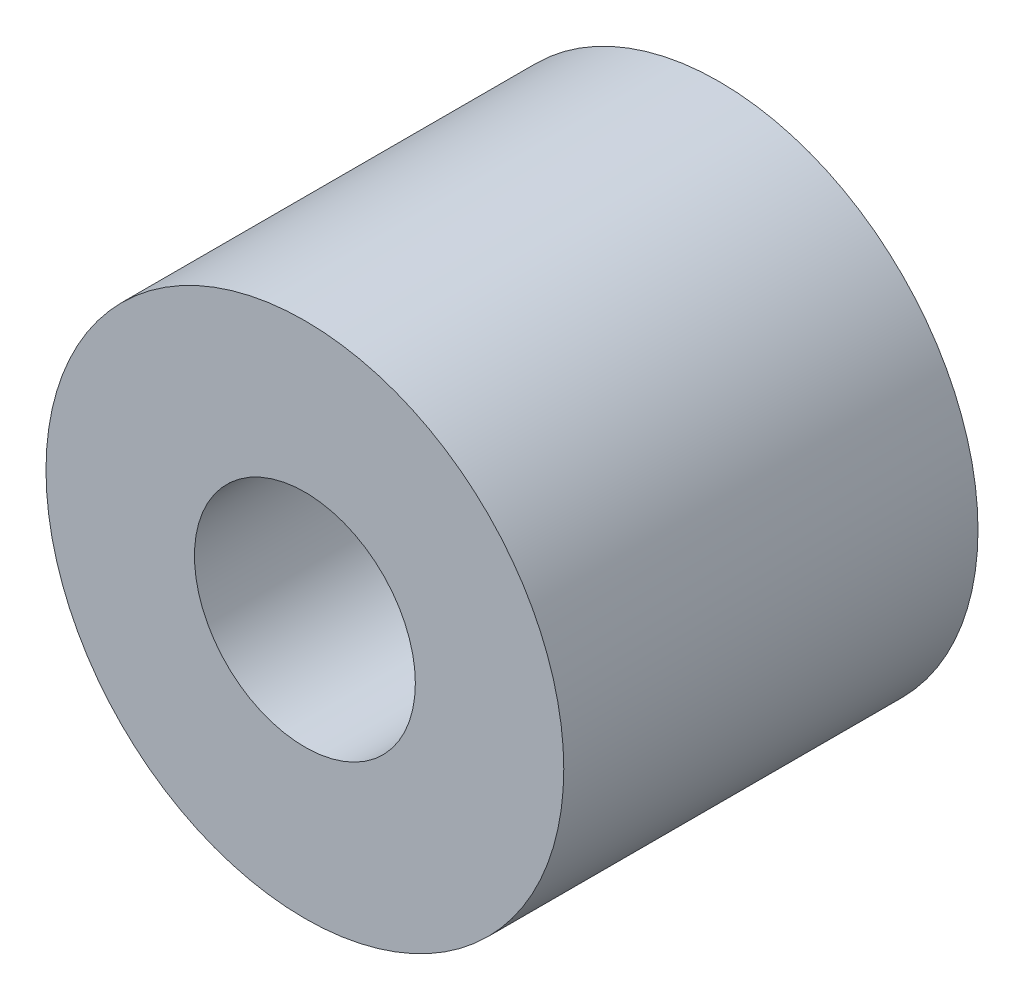
ISO-10303-21;
HEADER;
FILE_DESCRIPTION(('STEP AP214'),'2;1');
FILE_NAME('part.step','',(''),(''),'','','');
FILE_SCHEMA(('AUTOMOTIVE_DESIGN { 1 0 10303 214 1 1 1 1 }'));
ENDSEC;
DATA;
#1=APPLICATION_CONTEXT('core data for automotive mechanical design processes');
#2=APPLICATION_PROTOCOL_DEFINITION('international standard','automotive_design',2000,#1);
#3=PRODUCT_CONTEXT('',#1,'mechanical');
#4=PRODUCT('Part','Part','',(#3));
#5=PRODUCT_RELATED_PRODUCT_CATEGORY('part','',(#4));
#6=PRODUCT_DEFINITION_FORMATION('','',#4);
#7=PRODUCT_DEFINITION_CONTEXT('part definition',#1,'design');
#8=PRODUCT_DEFINITION('design','',#6,#7);
#9=PRODUCT_DEFINITION_SHAPE('','',#8);
#10=(LENGTH_UNIT() NAMED_UNIT(*) SI_UNIT(.MILLI.,.METRE.));
#11=(NAMED_UNIT(*) PLANE_ANGLE_UNIT() SI_UNIT($,.RADIAN.));
#12=(NAMED_UNIT(*) SI_UNIT($,.STERADIAN.) SOLID_ANGLE_UNIT());
#13=UNCERTAINTY_MEASURE_WITH_UNIT(LENGTH_MEASURE(1.E-05),#10,'distance_accuracy_value','');
#14=(GEOMETRIC_REPRESENTATION_CONTEXT(3) GLOBAL_UNCERTAINTY_ASSIGNED_CONTEXT((#13)) GLOBAL_UNIT_ASSIGNED_CONTEXT((#10,
#11,#12)) REPRESENTATION_CONTEXT('',''));
#15=CARTESIAN_POINT('',(0.,0.,0.));
#16=DIRECTION('',(0.,0.,1.));
#17=DIRECTION('',(1.,0.,0.));
#18=AXIS2_PLACEMENT_3D('',#15,#16,#17);
#19=CARTESIAN_POINT('',(0.,0.,12.));
#20=DIRECTION('',(0.,0.,1.));
#21=DIRECTION('',(1.,0.,0.));
#22=AXIS2_PLACEMENT_3D('',#19,#20,#21);
#23=PLANE('',#22);
#24=CARTESIAN_POINT('',(0.,0.,12.));
#25=DIRECTION('',(0.,0.,1.));
#26=DIRECTION('',(1.,0.,0.));
#27=AXIS2_PLACEMENT_3D('',#24,#25,#26);
#28=CIRCLE('',#27,7.5);
#29=CARTESIAN_POINT('',(7.5,0.,12.));
#30=VERTEX_POINT('',#29);
#31=EDGE_CURVE('E10',#30,#30,#28,.T.);
#32=ORIENTED_EDGE('',*,*,#31,.T.);
#33=EDGE_LOOP('',(#32));
#34=FACE_BOUND('',#33,.T.);
#35=CARTESIAN_POINT('',(0.,0.,12.));
#36=DIRECTION('',(0.,0.,1.));
#37=DIRECTION('',(1.,0.,0.));
#38=AXIS2_PLACEMENT_3D('',#35,#36,#37);
#39=CIRCLE('',#38,3.2);
#40=CARTESIAN_POINT('',(3.2,0.,12.));
#41=VERTEX_POINT('',#40);
#42=EDGE_CURVE('E42',#41,#41,#39,.T.);
#43=ORIENTED_EDGE('',*,*,#42,.F.);
#44=EDGE_LOOP('',(#43));
#45=FACE_BOUND('',#44,.T.);
#46=ADVANCED_FACE('F31',(#34,#45),#23,.T.);
#47=CARTESIAN_POINT('',(0.,0.,0.));
#48=DIRECTION('',(0.,0.,1.));
#49=DIRECTION('',(1.,0.,0.));
#50=AXIS2_PLACEMENT_3D('',#47,#48,#49);
#51=PLANE('',#50);
#52=CARTESIAN_POINT('',(0.,0.,0.));
#53=DIRECTION('',(0.,0.,1.));
#54=DIRECTION('',(1.,0.,0.));
#55=AXIS2_PLACEMENT_3D('',#52,#53,#54);
#56=CIRCLE('',#55,7.5);
#57=CARTESIAN_POINT('',(7.5,0.,0.));
#58=VERTEX_POINT('',#57);
#59=EDGE_CURVE('E35',#58,#58,#56,.T.);
#60=ORIENTED_EDGE('',*,*,#59,.F.);
#61=EDGE_LOOP('',(#60));
#62=FACE_BOUND('',#61,.T.);
#63=CARTESIAN_POINT('',(0.,0.,0.));
#64=DIRECTION('',(0.,0.,1.));
#65=DIRECTION('',(1.,0.,0.));
#66=AXIS2_PLACEMENT_3D('',#63,#64,#65);
#67=CIRCLE('',#66,3.2);
#68=CARTESIAN_POINT('',(3.2,0.,0.));
#69=VERTEX_POINT('',#68);
#70=EDGE_CURVE('E44',#69,#69,#67,.T.);
#71=ORIENTED_EDGE('',*,*,#70,.T.);
#72=EDGE_LOOP('',(#71));
#73=FACE_BOUND('',#72,.T.);
#74=ADVANCED_FACE('F54',(#62,#73),#51,.F.);
#75=CARTESIAN_POINT('',(0.,0.,12.));
#76=DIRECTION('',(0.,0.,-1.));
#77=DIRECTION('',(-1.,0.,0.));
#78=AXIS2_PLACEMENT_3D('',#75,#76,#77);
#79=CYLINDRICAL_SURFACE('',#78,7.5);
#80=ORIENTED_EDGE('',*,*,#31,.F.);
#81=EDGE_LOOP('',(#80));
#82=FACE_BOUND('',#81,.T.);
#83=ORIENTED_EDGE('',*,*,#59,.T.);
#84=EDGE_LOOP('',(#83));
#85=FACE_BOUND('',#84,.T.);
#86=ADVANCED_FACE('F33',(#82,#85),#79,.T.);
#87=CARTESIAN_POINT('',(0.,0.,12.));
#88=DIRECTION('',(0.,0.,-1.));
#89=DIRECTION('',(-1.,0.,0.));
#90=AXIS2_PLACEMENT_3D('',#87,#88,#89);
#91=CYLINDRICAL_SURFACE('',#90,3.2);
#92=ORIENTED_EDGE('',*,*,#42,.T.);
#93=EDGE_LOOP('',(#92));
#94=FACE_BOUND('',#93,.T.);
#95=ORIENTED_EDGE('',*,*,#70,.F.);
#96=EDGE_LOOP('',(#95));
#97=FACE_BOUND('',#96,.T.);
#98=ADVANCED_FACE('F50',(#94,#97),#91,.F.);
#99=CLOSED_SHELL('',(#46,#74,#86,#98));
#100=MANIFOLD_SOLID_BREP('B2',#99);
#101=ADVANCED_BREP_SHAPE_REPRESENTATION('',(#18,#100),#14);
#102=SHAPE_DEFINITION_REPRESENTATION(#9,#101);
ENDSEC;
END-ISO-10303-21;
